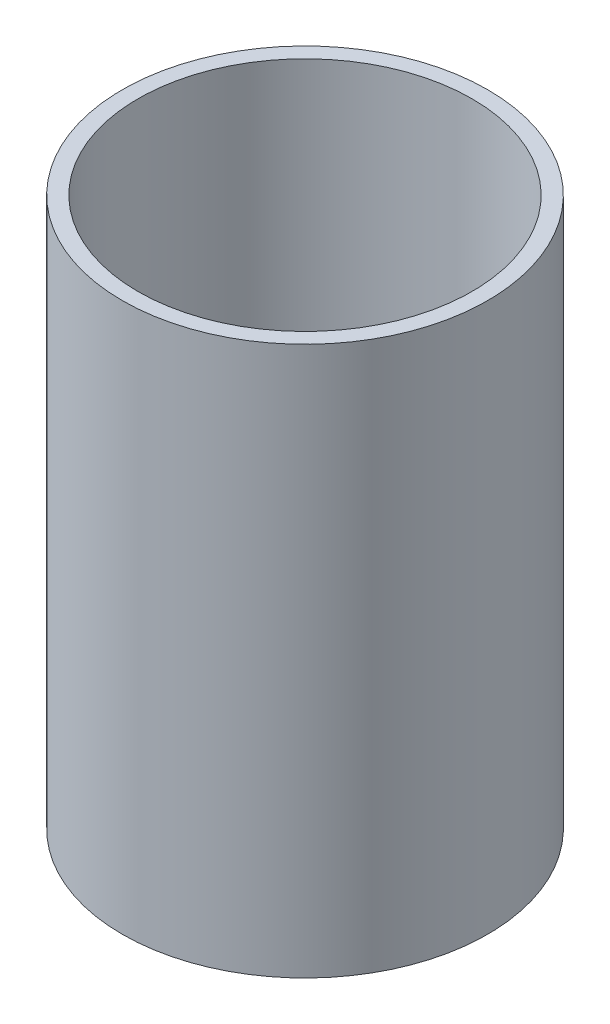
ISO-10303-21;
HEADER;
FILE_DESCRIPTION(('STEP AP214'),'2;1');
FILE_NAME('part.step','',(''),(''),'','','');
FILE_SCHEMA(('AUTOMOTIVE_DESIGN { 1 0 10303 214 1 1 1 1 }'));
ENDSEC;
DATA;
#1=APPLICATION_CONTEXT('core data for automotive mechanical design processes');
#2=APPLICATION_PROTOCOL_DEFINITION('international standard','automotive_design',2000,#1);
#3=PRODUCT_CONTEXT('',#1,'mechanical');
#4=PRODUCT('Part','Part','',(#3));
#5=PRODUCT_RELATED_PRODUCT_CATEGORY('part','',(#4));
#6=PRODUCT_DEFINITION_FORMATION('','',#4);
#7=PRODUCT_DEFINITION_CONTEXT('part definition',#1,'design');
#8=PRODUCT_DEFINITION('design','',#6,#7);
#9=PRODUCT_DEFINITION_SHAPE('','',#8);
#10=(LENGTH_UNIT() NAMED_UNIT(*) SI_UNIT(.MILLI.,.METRE.));
#11=(NAMED_UNIT(*) PLANE_ANGLE_UNIT() SI_UNIT($,.RADIAN.));
#12=(NAMED_UNIT(*) SI_UNIT($,.STERADIAN.) SOLID_ANGLE_UNIT());
#13=UNCERTAINTY_MEASURE_WITH_UNIT(LENGTH_MEASURE(1.E-05),#10,'distance_accuracy_value','');
#14=(GEOMETRIC_REPRESENTATION_CONTEXT(3) GLOBAL_UNCERTAINTY_ASSIGNED_CONTEXT((#13)) GLOBAL_UNIT_ASSIGNED_CONTEXT((#10,
#11,#12)) REPRESENTATION_CONTEXT('',''));
#15=CARTESIAN_POINT('',(0.,0.,0.));
#16=DIRECTION('',(0.,0.,1.));
#17=DIRECTION('',(1.,0.,0.));
#18=AXIS2_PLACEMENT_3D('',#15,#16,#17);
#19=CARTESIAN_POINT('',(27.718012734749,35.,-20.1439926174438));
#20=DIRECTION('',(0.,1.,0.));
#21=DIRECTION('',(0.,0.,1.));
#22=AXIS2_PLACEMENT_3D('',#19,#20,#21);
#23=PLANE('',#22);
#24=CARTESIAN_POINT('',(27.718012734749,35.,-20.1439926174438));
#25=DIRECTION('',(0.,1.,0.));
#26=DIRECTION('',(0.,0.,1.));
#27=AXIS2_PLACEMENT_3D('',#24,#25,#26);
#28=CIRCLE('',#27,11.6500000000003);
#29=CARTESIAN_POINT('',(27.718012734749,35.,-8.49399261744351));
#30=VERTEX_POINT('',#29);
#31=EDGE_CURVE('E10',#30,#30,#28,.T.);
#32=ORIENTED_EDGE('',*,*,#31,.T.);
#33=EDGE_LOOP('',(#32));
#34=FACE_BOUND('',#33,.T.);
#35=CARTESIAN_POINT('',(27.718012734749,35.,-20.1439926174438));
#36=DIRECTION('',(0.,1.,0.));
#37=DIRECTION('',(0.,0.,1.));
#38=AXIS2_PLACEMENT_3D('',#35,#36,#37);
#39=CIRCLE('',#38,10.6500000000003);
#40=CARTESIAN_POINT('',(27.718012734749,35.,-9.4939926174435));
#41=VERTEX_POINT('',#40);
#42=EDGE_CURVE('E41',#41,#41,#39,.T.);
#43=ORIENTED_EDGE('',*,*,#42,.F.);
#44=EDGE_LOOP('',(#43));
#45=FACE_BOUND('',#44,.T.);
#46=ADVANCED_FACE('F30',(#34,#45),#23,.T.);
#47=CARTESIAN_POINT('',(27.718012734749,0.,-20.1439926174438));
#48=DIRECTION('',(0.,1.,0.));
#49=DIRECTION('',(0.,0.,1.));
#50=AXIS2_PLACEMENT_3D('',#47,#48,#49);
#51=PLANE('',#50);
#52=CARTESIAN_POINT('',(27.718012734749,0.,-20.1439926174438));
#53=DIRECTION('',(0.,1.,0.));
#54=DIRECTION('',(0.,0.,1.));
#55=AXIS2_PLACEMENT_3D('',#52,#53,#54);
#56=CIRCLE('',#55,11.6500000000003);
#57=CARTESIAN_POINT('',(27.718012734749,0.,-8.49399261744351));
#58=VERTEX_POINT('',#57);
#59=EDGE_CURVE('E34',#58,#58,#56,.T.);
#60=ORIENTED_EDGE('',*,*,#59,.F.);
#61=EDGE_LOOP('',(#60));
#62=FACE_BOUND('',#61,.T.);
#63=CARTESIAN_POINT('',(27.718012734749,0.,-20.1439926174438));
#64=DIRECTION('',(0.,1.,0.));
#65=DIRECTION('',(0.,0.,1.));
#66=AXIS2_PLACEMENT_3D('',#63,#64,#65);
#67=CIRCLE('',#66,10.6500000000003);
#68=CARTESIAN_POINT('',(27.718012734749,0.,-9.4939926174435));
#69=VERTEX_POINT('',#68);
#70=EDGE_CURVE('E43',#69,#69,#67,.T.);
#71=ORIENTED_EDGE('',*,*,#70,.T.);
#72=EDGE_LOOP('',(#71));
#73=FACE_BOUND('',#72,.T.);
#74=ADVANCED_FACE('F53',(#62,#73),#51,.F.);
#75=CARTESIAN_POINT('',(27.718012734749,35.,-20.1439926174438));
#76=DIRECTION('',(0.,-1.,0.));
#77=DIRECTION('',(0.,0.,-1.));
#78=AXIS2_PLACEMENT_3D('',#75,#76,#77);
#79=CYLINDRICAL_SURFACE('',#78,11.6500000000003);
#80=ORIENTED_EDGE('',*,*,#31,.F.);
#81=EDGE_LOOP('',(#80));
#82=FACE_BOUND('',#81,.T.);
#83=ORIENTED_EDGE('',*,*,#59,.T.);
#84=EDGE_LOOP('',(#83));
#85=FACE_BOUND('',#84,.T.);
#86=ADVANCED_FACE('F32',(#82,#85),#79,.T.);
#87=CARTESIAN_POINT('',(27.718012734749,35.,-20.1439926174438));
#88=DIRECTION('',(0.,-1.,0.));
#89=DIRECTION('',(0.,0.,-1.));
#90=AXIS2_PLACEMENT_3D('',#87,#88,#89);
#91=CYLINDRICAL_SURFACE('',#90,10.6500000000003);
#92=ORIENTED_EDGE('',*,*,#42,.T.);
#93=EDGE_LOOP('',(#92));
#94=FACE_BOUND('',#93,.T.);
#95=ORIENTED_EDGE('',*,*,#70,.F.);
#96=EDGE_LOOP('',(#95));
#97=FACE_BOUND('',#96,.T.);
#98=ADVANCED_FACE('F49',(#94,#97),#91,.F.);
#99=CLOSED_SHELL('',(#46,#74,#86,#98));
#100=MANIFOLD_SOLID_BREP('B2',#99);
#101=ADVANCED_BREP_SHAPE_REPRESENTATION('',(#18,#100),#14);
#102=SHAPE_DEFINITION_REPRESENTATION(#9,#101);
ENDSEC;
END-ISO-10303-21;
